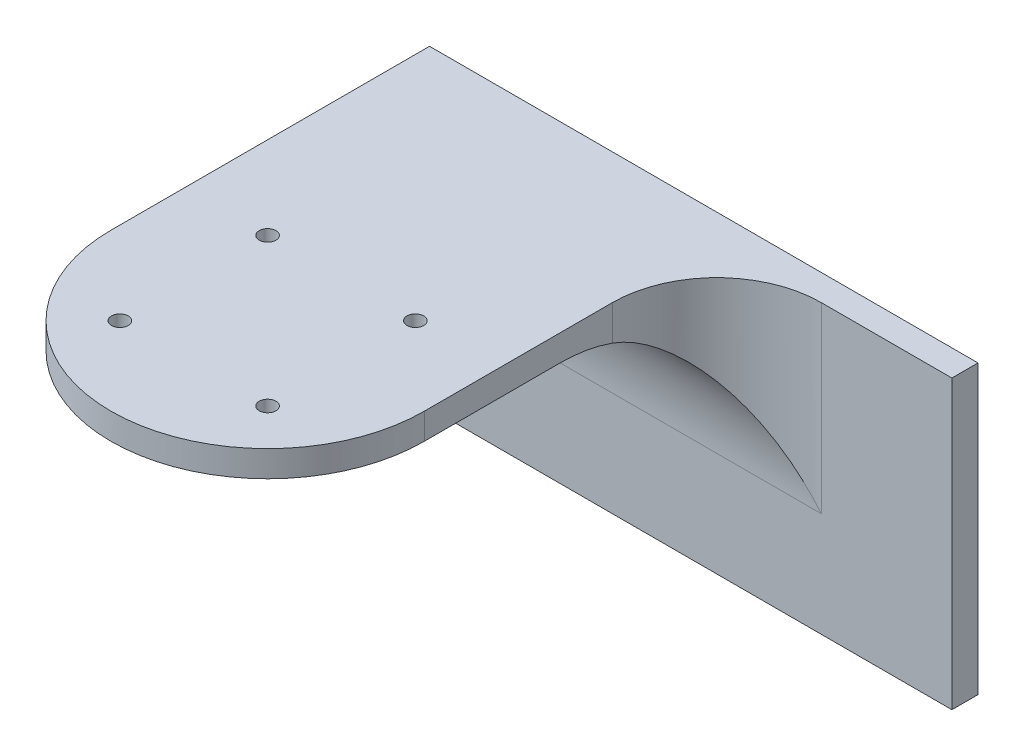
ISO-10303-21;
HEADER;
FILE_DESCRIPTION(('STEP AP214'),'2;1');
FILE_NAME('part.step','',(''),(''),'','','');
FILE_SCHEMA(('AUTOMOTIVE_DESIGN { 1 0 10303 214 1 1 1 1 }'));
ENDSEC;
DATA;
#1=APPLICATION_CONTEXT('core data for automotive mechanical design processes');
#2=APPLICATION_PROTOCOL_DEFINITION('international standard','automotive_design',2000,#1);
#3=PRODUCT_CONTEXT('',#1,'mechanical');
#4=PRODUCT('Part','Part','',(#3));
#5=PRODUCT_RELATED_PRODUCT_CATEGORY('part','',(#4));
#6=PRODUCT_DEFINITION_FORMATION('','',#4);
#7=PRODUCT_DEFINITION_CONTEXT('part definition',#1,'design');
#8=PRODUCT_DEFINITION('design','',#6,#7);
#9=PRODUCT_DEFINITION_SHAPE('','',#8);
#10=(LENGTH_UNIT() NAMED_UNIT(*) SI_UNIT(.MILLI.,.METRE.));
#11=(NAMED_UNIT(*) PLANE_ANGLE_UNIT() SI_UNIT($,.RADIAN.));
#12=(NAMED_UNIT(*) SI_UNIT($,.STERADIAN.) SOLID_ANGLE_UNIT());
#13=UNCERTAINTY_MEASURE_WITH_UNIT(LENGTH_MEASURE(1.E-05),#10,'distance_accuracy_value','');
#14=(GEOMETRIC_REPRESENTATION_CONTEXT(3) GLOBAL_UNCERTAINTY_ASSIGNED_CONTEXT((#13)) GLOBAL_UNIT_ASSIGNED_CONTEXT((#10,
#11,#12)) REPRESENTATION_CONTEXT('',''));
#15=CARTESIAN_POINT('',(0.,0.,0.));
#16=DIRECTION('',(0.,0.,1.));
#17=DIRECTION('',(1.,0.,0.));
#18=AXIS2_PLACEMENT_3D('',#15,#16,#17);
#19=CARTESIAN_POINT('',(30.,5.,0.));
#20=DIRECTION('',(1.,0.,0.));
#21=DIRECTION('',(0.,0.,-1.));
#22=AXIS2_PLACEMENT_3D('',#19,#20,#21);
#23=PLANE('',#22);
#24=CARTESIAN_POINT('',(30.,-30.,-26.));
#25=DIRECTION('',(1.,0.,0.));
#26=DIRECTION('',(0.,0.,-1.));
#27=AXIS2_PLACEMENT_3D('',#24,#25,#26);
#28=CIRCLE('',#27,30.);
#29=CARTESIAN_POINT('',(30.,0.,-26.));
#30=VERTEX_POINT('',#29);
#31=CARTESIAN_POINT('',(30.,-1.7157287525381,-36.));
#32=VERTEX_POINT('',#31);
#33=EDGE_CURVE('E205',#30,#32,#28,.F.);
#34=ORIENTED_EDGE('',*,*,#33,.T.);
#35=DIRECTION('',(0.,-1.,0.));
#36=VECTOR('',#35,1.);
#37=CARTESIAN_POINT('',(30.,5.,-36.));
#38=LINE('',#37,#36);
#39=CARTESIAN_POINT('',(30.,5.,-36.));
#40=VERTEX_POINT('',#39);
#41=EDGE_CURVE('E57',#32,#40,#38,.F.);
#42=ORIENTED_EDGE('',*,*,#41,.T.);
#43=DIRECTION('',(0.,0.,1.));
#44=VECTOR('',#43,1.);
#45=CARTESIAN_POINT('',(30.,5.,0.));
#46=LINE('',#45,#44);
#47=CARTESIAN_POINT('',(30.,5.,0.));
#48=VERTEX_POINT('',#47);
#49=EDGE_CURVE('E156',#40,#48,#46,.T.);
#50=ORIENTED_EDGE('',*,*,#49,.T.);
#51=DIRECTION('',(0.,-1.,0.));
#52=VECTOR('',#51,1.);
#53=CARTESIAN_POINT('',(30.,5.,0.));
#54=LINE('',#53,#52);
#55=CARTESIAN_POINT('',(30.,0.,0.));
#56=VERTEX_POINT('',#55);
#57=EDGE_CURVE('E162',#48,#56,#54,.T.);
#58=ORIENTED_EDGE('',*,*,#57,.T.);
#59=DIRECTION('',(0.,0.,1.));
#60=VECTOR('',#59,1.);
#61=CARTESIAN_POINT('',(30.,0.,0.));
#62=LINE('',#61,#60);
#63=EDGE_CURVE('E154',#30,#56,#62,.T.);
#64=ORIENTED_EDGE('',*,*,#63,.F.);
#65=EDGE_LOOP('',(#34,#42,#50,#58,#64));
#66=FACE_BOUND('',#65,.T.);
#67=ADVANCED_FACE('F41',(#66),#23,.T.);
#68=CARTESIAN_POINT('',(0.,0.,0.));
#69=DIRECTION('',(0.,1.,0.));
#70=DIRECTION('',(0.,0.,1.));
#71=AXIS2_PLACEMENT_3D('',#68,#69,#70);
#72=PLANE('',#71);
#73=CARTESIAN_POINT('',(14.142135623731,0.,14.1421356237309));
#74=DIRECTION('',(0.,1.,0.));
#75=DIRECTION('',(0.,0.,1.));
#76=AXIS2_PLACEMENT_3D('',#73,#74,#75);
#77=CIRCLE('',#76,1.6);
#78=CARTESIAN_POINT('',(14.142135623731,0.,15.7421356237309));
#79=VERTEX_POINT('',#78);
#80=EDGE_CURVE('E165',#79,#79,#77,.T.);
#81=ORIENTED_EDGE('',*,*,#80,.T.);
#82=EDGE_LOOP('',(#81));
#83=FACE_BOUND('',#82,.T.);
#84=CARTESIAN_POINT('',(-14.142135623731,0.,14.1421356237309));
#85=DIRECTION('',(0.,1.,0.));
#86=DIRECTION('',(0.,0.,1.));
#87=AXIS2_PLACEMENT_3D('',#84,#85,#86);
#88=CIRCLE('',#87,1.6);
#89=CARTESIAN_POINT('',(-14.142135623731,0.,15.7421356237309));
#90=VERTEX_POINT('',#89);
#91=EDGE_CURVE('E173',#90,#90,#88,.T.);
#92=ORIENTED_EDGE('',*,*,#91,.T.);
#93=EDGE_LOOP('',(#92));
#94=FACE_BOUND('',#93,.T.);
#95=CARTESIAN_POINT('',(-14.142135623731,0.,-14.1421356237309));
#96=DIRECTION('',(0.,1.,0.));
#97=DIRECTION('',(0.,0.,1.));
#98=AXIS2_PLACEMENT_3D('',#95,#96,#97);
#99=CIRCLE('',#98,1.6);
#100=CARTESIAN_POINT('',(-14.142135623731,0.,-12.5421356237309));
#101=VERTEX_POINT('',#100);
#102=EDGE_CURVE('E179',#101,#101,#99,.T.);
#103=ORIENTED_EDGE('',*,*,#102,.T.);
#104=EDGE_LOOP('',(#103));
#105=FACE_BOUND('',#104,.T.);
#106=CARTESIAN_POINT('',(14.142135623731,0.,-14.1421356237309));
#107=DIRECTION('',(0.,1.,0.));
#108=DIRECTION('',(0.,0.,1.));
#109=AXIS2_PLACEMENT_3D('',#106,#107,#108);
#110=CIRCLE('',#109,1.6);
#111=CARTESIAN_POINT('',(14.142135623731,0.,-12.5421356237309));
#112=VERTEX_POINT('',#111);
#113=EDGE_CURVE('E185',#112,#112,#110,.T.);
#114=ORIENTED_EDGE('',*,*,#113,.T.);
#115=EDGE_LOOP('',(#114));
#116=FACE_BOUND('',#115,.T.);
#117=DIRECTION('',(0.,0.,-1.));
#118=VECTOR('',#117,1.);
#119=CARTESIAN_POINT('',(-30.,0.,0.));
#120=LINE('',#119,#118);
#121=CARTESIAN_POINT('',(-30.,0.,0.));
#122=VERTEX_POINT('',#121);
#123=CARTESIAN_POINT('',(-30.,0.,-26.));
#124=VERTEX_POINT('',#123);
#125=EDGE_CURVE('E149',#122,#124,#120,.T.);
#126=ORIENTED_EDGE('',*,*,#125,.T.);
#127=DIRECTION('',(-1.,0.,0.));
#128=VECTOR('',#127,1.);
#129=CARTESIAN_POINT('',(30.,0.,-26.));
#130=LINE('',#129,#128);
#131=EDGE_CURVE('E201',#124,#30,#130,.F.);
#132=ORIENTED_EDGE('',*,*,#131,.T.);
#133=ORIENTED_EDGE('',*,*,#63,.T.);
#134=CARTESIAN_POINT('',(0.,0.,0.));
#135=DIRECTION('',(0.,1.,0.));
#136=DIRECTION('',(0.,0.,1.));
#137=AXIS2_PLACEMENT_3D('',#134,#135,#136);
#138=CIRCLE('',#137,30.);
#139=EDGE_CURVE('E191',#122,#56,#138,.T.);
#140=ORIENTED_EDGE('',*,*,#139,.F.);
#141=EDGE_LOOP('',(#126,#132,#133,#140));
#142=FACE_BOUND('',#141,.T.);
#143=ADVANCED_FACE('F222',(#83,#94,#105,#116,#142),#72,.F.);
#144=CARTESIAN_POINT('',(0.,5.,0.));
#145=DIRECTION('',(0.,-1.,0.));
#146=DIRECTION('',(0.,0.,-1.));
#147=AXIS2_PLACEMENT_3D('',#144,#145,#146);
#148=CYLINDRICAL_SURFACE('',#147,30.);
#149=ORIENTED_EDGE('',*,*,#57,.F.);
#150=CARTESIAN_POINT('',(0.,5.,0.));
#151=DIRECTION('',(0.,1.,0.));
#152=DIRECTION('',(0.,0.,1.));
#153=AXIS2_PLACEMENT_3D('',#150,#151,#152);
#154=CIRCLE('',#153,30.);
#155=CARTESIAN_POINT('',(-30.,5.,0.));
#156=VERTEX_POINT('',#155);
#157=EDGE_CURVE('E194',#156,#48,#154,.T.);
#158=ORIENTED_EDGE('',*,*,#157,.F.);
#159=DIRECTION('',(0.,-1.,0.));
#160=VECTOR('',#159,1.);
#161=CARTESIAN_POINT('',(-30.,5.,0.));
#162=LINE('',#161,#160);
#163=EDGE_CURVE('E158',#156,#122,#162,.T.);
#164=ORIENTED_EDGE('',*,*,#163,.T.);
#165=ORIENTED_EDGE('',*,*,#139,.T.);
#166=EDGE_LOOP('',(#149,#158,#164,#165));
#167=FACE_BOUND('',#166,.T.);
#168=ADVANCED_FACE('F218',(#167),#148,.T.);
#169=CARTESIAN_POINT('',(0.,5.,0.));
#170=DIRECTION('',(0.,1.,0.));
#171=DIRECTION('',(0.,0.,1.));
#172=AXIS2_PLACEMENT_3D('',#169,#170,#171);
#173=PLANE('',#172);
#174=CARTESIAN_POINT('',(-14.142135623731,5.,14.1421356237309));
#175=DIRECTION('',(0.,1.,0.));
#176=DIRECTION('',(0.,0.,1.));
#177=AXIS2_PLACEMENT_3D('',#174,#175,#176);
#178=CIRCLE('',#177,1.6);
#179=CARTESIAN_POINT('',(-14.142135623731,5.,15.7421356237309));
#180=VERTEX_POINT('',#179);
#181=EDGE_CURVE('E176',#180,#180,#178,.T.);
#182=ORIENTED_EDGE('',*,*,#181,.F.);
#183=EDGE_LOOP('',(#182));
#184=FACE_BOUND('',#183,.T.);
#185=CARTESIAN_POINT('',(14.142135623731,5.,-14.1421356237309));
#186=DIRECTION('',(0.,1.,0.));
#187=DIRECTION('',(0.,0.,1.));
#188=AXIS2_PLACEMENT_3D('',#185,#186,#187);
#189=CIRCLE('',#188,1.6);
#190=CARTESIAN_POINT('',(14.142135623731,5.,-12.5421356237309));
#191=VERTEX_POINT('',#190);
#192=EDGE_CURVE('E188',#191,#191,#189,.T.);
#193=ORIENTED_EDGE('',*,*,#192,.F.);
#194=EDGE_LOOP('',(#193));
#195=FACE_BOUND('',#194,.T.);
#196=ORIENTED_EDGE('',*,*,#157,.T.);
#197=ORIENTED_EDGE('',*,*,#49,.F.);
#198=CARTESIAN_POINT('',(50.,5.,-36.));
#199=DIRECTION('',(0.,1.,0.));
#200=DIRECTION('',(0.,0.,1.));
#201=AXIS2_PLACEMENT_3D('',#198,#199,#200);
#202=CIRCLE('',#201,20.);
#203=CARTESIAN_POINT('',(50.,5.,-56.));
#204=VERTEX_POINT('',#203);
#205=EDGE_CURVE('E11',#40,#204,#202,.F.);
#206=ORIENTED_EDGE('',*,*,#205,.T.);
#207=DIRECTION('',(-1.,0.,0.));
#208=VECTOR('',#207,1.);
#209=CARTESIAN_POINT('',(75.,5.,-56.));
#210=LINE('',#209,#208);
#211=CARTESIAN_POINT('',(75.,5.,-56.));
#212=VERTEX_POINT('',#211);
#213=EDGE_CURVE('E143',#212,#204,#210,.T.);
#214=ORIENTED_EDGE('',*,*,#213,.F.);
#215=DIRECTION('',(0.,0.,1.));
#216=VECTOR('',#215,1.);
#217=CARTESIAN_POINT('',(75.,5.,-56.));
#218=LINE('',#217,#216);
#219=CARTESIAN_POINT('',(75.,5.,-61.));
#220=VERTEX_POINT('',#219);
#221=EDGE_CURVE('E137',#220,#212,#218,.T.);
#222=ORIENTED_EDGE('',*,*,#221,.F.);
#223=DIRECTION('',(1.,0.,0.));
#224=VECTOR('',#223,1.);
#225=CARTESIAN_POINT('',(-30.,5.,-61.));
#226=LINE('',#225,#224);
#227=CARTESIAN_POINT('',(-30.,5.,-61.));
#228=VERTEX_POINT('',#227);
#229=EDGE_CURVE('E153',#228,#220,#226,.T.);
#230=ORIENTED_EDGE('',*,*,#229,.F.);
#231=DIRECTION('',(0.,0.,-1.));
#232=VECTOR('',#231,1.);
#233=CARTESIAN_POINT('',(-30.,5.,0.));
#234=LINE('',#233,#232);
#235=EDGE_CURVE('E150',#156,#228,#234,.T.);
#236=ORIENTED_EDGE('',*,*,#235,.F.);
#237=EDGE_LOOP('',(#196,#197,#206,#214,#222,#230,#236));
#238=FACE_BOUND('',#237,.T.);
#239=CARTESIAN_POINT('',(-14.142135623731,5.,-14.1421356237309));
#240=DIRECTION('',(0.,1.,0.));
#241=DIRECTION('',(0.,0.,1.));
#242=AXIS2_PLACEMENT_3D('',#239,#240,#241);
#243=CIRCLE('',#242,1.6);
#244=CARTESIAN_POINT('',(-14.142135623731,5.,-12.5421356237309));
#245=VERTEX_POINT('',#244);
#246=EDGE_CURVE('E182',#245,#245,#243,.T.);
#247=ORIENTED_EDGE('',*,*,#246,.F.);
#248=EDGE_LOOP('',(#247));
#249=FACE_BOUND('',#248,.T.);
#250=CARTESIAN_POINT('',(14.142135623731,5.,14.1421356237309));
#251=DIRECTION('',(0.,1.,0.));
#252=DIRECTION('',(0.,0.,1.));
#253=AXIS2_PLACEMENT_3D('',#250,#251,#252);
#254=CIRCLE('',#253,1.6);
#255=CARTESIAN_POINT('',(14.142135623731,5.,15.7421356237309));
#256=VERTEX_POINT('',#255);
#257=EDGE_CURVE('E170',#256,#256,#254,.T.);
#258=ORIENTED_EDGE('',*,*,#257,.F.);
#259=EDGE_LOOP('',(#258));
#260=FACE_BOUND('',#259,.T.);
#261=ADVANCED_FACE('F221',(#184,#195,#238,#249,#260),#173,.T.);
#262=CARTESIAN_POINT('',(14.142135623731,5.,-14.1421356237309));
#263=DIRECTION('',(0.,-1.,0.));
#264=DIRECTION('',(0.,0.,-1.));
#265=AXIS2_PLACEMENT_3D('',#262,#263,#264);
#266=CYLINDRICAL_SURFACE('',#265,1.6);
#267=ORIENTED_EDGE('',*,*,#192,.T.);
#268=EDGE_LOOP('',(#267));
#269=FACE_BOUND('',#268,.T.);
#270=ORIENTED_EDGE('',*,*,#113,.F.);
#271=EDGE_LOOP('',(#270));
#272=FACE_BOUND('',#271,.T.);
#273=ADVANCED_FACE('F229',(#269,#272),#266,.F.);
#274=CARTESIAN_POINT('',(-14.142135623731,5.,-14.1421356237309));
#275=DIRECTION('',(0.,-1.,0.));
#276=DIRECTION('',(0.,0.,-1.));
#277=AXIS2_PLACEMENT_3D('',#274,#275,#276);
#278=CYLINDRICAL_SURFACE('',#277,1.6);
#279=ORIENTED_EDGE('',*,*,#246,.T.);
#280=EDGE_LOOP('',(#279));
#281=FACE_BOUND('',#280,.T.);
#282=ORIENTED_EDGE('',*,*,#102,.F.);
#283=EDGE_LOOP('',(#282));
#284=FACE_BOUND('',#283,.T.);
#285=ADVANCED_FACE('F233',(#281,#284),#278,.F.);
#286=CARTESIAN_POINT('',(-14.142135623731,5.,14.1421356237309));
#287=DIRECTION('',(0.,-1.,0.));
#288=DIRECTION('',(0.,0.,-1.));
#289=AXIS2_PLACEMENT_3D('',#286,#287,#288);
#290=CYLINDRICAL_SURFACE('',#289,1.6);
#291=ORIENTED_EDGE('',*,*,#181,.T.);
#292=EDGE_LOOP('',(#291));
#293=FACE_BOUND('',#292,.T.);
#294=ORIENTED_EDGE('',*,*,#91,.F.);
#295=EDGE_LOOP('',(#294));
#296=FACE_BOUND('',#295,.T.);
#297=ADVANCED_FACE('F237',(#293,#296),#290,.F.);
#298=CARTESIAN_POINT('',(14.142135623731,5.,14.1421356237309));
#299=DIRECTION('',(0.,-1.,0.));
#300=DIRECTION('',(0.,0.,-1.));
#301=AXIS2_PLACEMENT_3D('',#298,#299,#300);
#302=CYLINDRICAL_SURFACE('',#301,1.6);
#303=ORIENTED_EDGE('',*,*,#257,.T.);
#304=EDGE_LOOP('',(#303));
#305=FACE_BOUND('',#304,.T.);
#306=ORIENTED_EDGE('',*,*,#80,.F.);
#307=EDGE_LOOP('',(#306));
#308=FACE_BOUND('',#307,.T.);
#309=ADVANCED_FACE('F241',(#305,#308),#302,.F.);
#310=CARTESIAN_POINT('',(-30.,5.,-61.));
#311=DIRECTION('',(0.,0.,-1.));
#312=DIRECTION('',(-1.,0.,0.));
#313=AXIS2_PLACEMENT_3D('',#310,#311,#312);
#314=PLANE('',#313);
#315=ORIENTED_EDGE('',*,*,#229,.T.);
#316=DIRECTION('',(0.,1.,0.));
#317=VECTOR('',#316,1.);
#318=CARTESIAN_POINT('',(75.,-50.,-61.));
#319=LINE('',#318,#317);
#320=CARTESIAN_POINT('',(75.,-50.,-61.));
#321=VERTEX_POINT('',#320);
#322=EDGE_CURVE('E133',#321,#220,#319,.T.);
#323=ORIENTED_EDGE('',*,*,#322,.F.);
#324=DIRECTION('',(1.,0.,0.));
#325=VECTOR('',#324,1.);
#326=CARTESIAN_POINT('',(-30.,-50.,-61.));
#327=LINE('',#326,#325);
#328=CARTESIAN_POINT('',(-30.,-50.,-61.));
#329=VERTEX_POINT('',#328);
#330=EDGE_CURVE('E124',#329,#321,#327,.T.);
#331=ORIENTED_EDGE('',*,*,#330,.F.);
#332=DIRECTION('',(0.,-1.,0.));
#333=VECTOR('',#332,1.);
#334=CARTESIAN_POINT('',(-30.,5.,-61.));
#335=LINE('',#334,#333);
#336=EDGE_CURVE('E166',#228,#329,#335,.T.);
#337=ORIENTED_EDGE('',*,*,#336,.F.);
#338=EDGE_LOOP('',(#315,#323,#331,#337));
#339=FACE_BOUND('',#338,.T.);
#340=ADVANCED_FACE('F245',(#339),#314,.T.);
#341=CARTESIAN_POINT('',(-30.,5.,0.));
#342=DIRECTION('',(-1.,0.,0.));
#343=DIRECTION('',(0.,0.,1.));
#344=AXIS2_PLACEMENT_3D('',#341,#342,#343);
#345=PLANE('',#344);
#346=ORIENTED_EDGE('',*,*,#125,.F.);
#347=ORIENTED_EDGE('',*,*,#163,.F.);
#348=ORIENTED_EDGE('',*,*,#235,.T.);
#349=ORIENTED_EDGE('',*,*,#336,.T.);
#350=DIRECTION('',(0.,0.,-1.));
#351=VECTOR('',#350,1.);
#352=CARTESIAN_POINT('',(-30.,-50.,-61.));
#353=LINE('',#352,#351);
#354=CARTESIAN_POINT('',(-30.,-50.,-56.));
#355=VERTEX_POINT('',#354);
#356=EDGE_CURVE('E145',#355,#329,#353,.T.);
#357=ORIENTED_EDGE('',*,*,#356,.F.);
#358=DIRECTION('',(0.,1.,0.));
#359=VECTOR('',#358,1.);
#360=CARTESIAN_POINT('',(-30.,-50.,-56.));
#361=LINE('',#360,#359);
#362=CARTESIAN_POINT('',(-30.,-30.,-56.));
#363=VERTEX_POINT('',#362);
#364=EDGE_CURVE('E120',#355,#363,#361,.T.);
#365=ORIENTED_EDGE('',*,*,#364,.T.);
#366=CARTESIAN_POINT('',(-30.,-30.,-26.));
#367=DIRECTION('',(-1.,0.,0.));
#368=DIRECTION('',(0.,0.,1.));
#369=AXIS2_PLACEMENT_3D('',#366,#367,#368);
#370=CIRCLE('',#369,30.);
#371=EDGE_CURVE('E203',#363,#124,#370,.F.);
#372=ORIENTED_EDGE('',*,*,#371,.T.);
#373=EDGE_LOOP('',(#346,#347,#348,#349,#357,#365,#372));
#374=FACE_BOUND('',#373,.T.);
#375=ADVANCED_FACE('F247',(#374),#345,.T.);
#376=CARTESIAN_POINT('',(-30.,-50.,-56.));
#377=DIRECTION('',(0.,0.,-1.));
#378=DIRECTION('',(-1.,0.,0.));
#379=AXIS2_PLACEMENT_3D('',#376,#377,#378);
#380=PLANE('',#379);
#381=ORIENTED_EDGE('',*,*,#213,.T.);
#382=DIRECTION('',(0.,-1.,0.));
#383=VECTOR('',#382,1.);
#384=CARTESIAN_POINT('',(50.,-50.,-56.));
#385=LINE('',#384,#383);
#386=CARTESIAN_POINT('',(50.,-30.,-56.));
#387=VERTEX_POINT('',#386);
#388=EDGE_CURVE('E207',#204,#387,#385,.T.);
#389=ORIENTED_EDGE('',*,*,#388,.T.);
#390=DIRECTION('',(-1.,0.,0.));
#391=VECTOR('',#390,1.);
#392=CARTESIAN_POINT('',(-30.,-30.,-56.));
#393=LINE('',#392,#391);
#394=EDGE_CURVE('E197',#387,#363,#393,.T.);
#395=ORIENTED_EDGE('',*,*,#394,.T.);
#396=ORIENTED_EDGE('',*,*,#364,.F.);
#397=DIRECTION('',(-1.,0.,0.));
#398=VECTOR('',#397,1.);
#399=CARTESIAN_POINT('',(-30.,-50.,-56.));
#400=LINE('',#399,#398);
#401=CARTESIAN_POINT('',(75.,-50.,-56.));
#402=VERTEX_POINT('',#401);
#403=EDGE_CURVE('E112',#402,#355,#400,.T.);
#404=ORIENTED_EDGE('',*,*,#403,.F.);
#405=DIRECTION('',(0.,-1.,0.));
#406=VECTOR('',#405,1.);
#407=CARTESIAN_POINT('',(75.,-50.,-56.));
#408=LINE('',#407,#406);
#409=EDGE_CURVE('E117',#212,#402,#408,.T.);
#410=ORIENTED_EDGE('',*,*,#409,.F.);
#411=EDGE_LOOP('',(#381,#389,#395,#396,#404,#410));
#412=FACE_BOUND('',#411,.T.);
#413=ADVANCED_FACE('F115',(#412),#380,.F.);
#414=CARTESIAN_POINT('',(0.,-50.,0.));
#415=DIRECTION('',(0.,1.,0.));
#416=DIRECTION('',(0.,0.,1.));
#417=AXIS2_PLACEMENT_3D('',#414,#415,#416);
#418=PLANE('',#417);
#419=ORIENTED_EDGE('',*,*,#356,.T.);
#420=ORIENTED_EDGE('',*,*,#330,.T.);
#421=DIRECTION('',(0.,0.,-1.));
#422=VECTOR('',#421,1.);
#423=CARTESIAN_POINT('',(75.,-50.,-56.));
#424=LINE('',#423,#422);
#425=EDGE_CURVE('E127',#402,#321,#424,.T.);
#426=ORIENTED_EDGE('',*,*,#425,.F.);
#427=ORIENTED_EDGE('',*,*,#403,.T.);
#428=EDGE_LOOP('',(#419,#420,#426,#427));
#429=FACE_BOUND('',#428,.T.);
#430=ADVANCED_FACE('F128',(#429),#418,.F.);
#431=CARTESIAN_POINT('',(-30.,-30.,-26.));
#432=DIRECTION('',(1.,0.,0.));
#433=DIRECTION('',(0.,0.,-1.));
#434=AXIS2_PLACEMENT_3D('',#431,#432,#433);
#435=CYLINDRICAL_SURFACE('',#434,30.);
#436=ORIENTED_EDGE('',*,*,#33,.F.);
#437=ORIENTED_EDGE('',*,*,#131,.F.);
#438=ORIENTED_EDGE('',*,*,#371,.F.);
#439=ORIENTED_EDGE('',*,*,#394,.F.);
#440=CARTESIAN_POINT('',(30.,-1.7157287525381,-36.));
#441=CARTESIAN_POINT('',(29.9999930948107,-1.81536678616711,-36.2818488233556));
#442=CARTESIAN_POINT('',(30.005957571046,-1.91922903873065,-36.5621815766427));
#443=CARTESIAN_POINT('',(30.0293943970698,-2.13508792447432,-37.1191594704881));
#444=CARTESIAN_POINT('',(30.0468648113315,-2.24708318670223,-37.3958052232888));
#445=CARTESIAN_POINT('',(30.0928444921743,-2.47875431466027,-37.9444381382878));
#446=CARTESIAN_POINT('',(30.1213372042878,-2.59841843866027,-38.2164316510301));
#447=CARTESIAN_POINT('',(30.1888861317535,-2.84523477039032,-38.7556532605113));
#448=CARTESIAN_POINT('',(30.2279427802565,-2.97238728499789,-39.0228811613678));
#449=CARTESIAN_POINT('',(30.3593412065543,-3.36191290187877,-39.8113494628475));
#450=CARTESIAN_POINT('',(30.4664092645607,-3.63476754328379,-40.3250720017956));
#451=CARTESIAN_POINT('',(30.7161774568456,-4.20573161184642,-41.3293791312611));
#452=CARTESIAN_POINT('',(30.8588943791015,-4.50385289389549,-41.8199526905455));
#453=CARTESIAN_POINT('',(31.2122510258561,-5.19301975560505,-42.8849723320195));
#454=CARTESIAN_POINT('',(31.4309575850857,-5.58976302982095,-43.4530669927568));
#455=CARTESIAN_POINT('',(31.9095361280971,-6.41212595962028,-44.549451523429));
#456=CARTESIAN_POINT('',(32.1694134841464,-6.8377493795476,-45.0777361853694));
#457=CARTESIAN_POINT('',(32.7254507572179,-7.71531520807471,-46.0959293198733));
#458=CARTESIAN_POINT('',(33.0217556308843,-8.16735874853232,-46.5856708606974));
#459=CARTESIAN_POINT('',(33.6444580214636,-9.09231657736616,-47.5244781152411));
#460=CARTESIAN_POINT('',(33.970857931182,-9.56523252371111,-47.9735405889996));
#461=CARTESIAN_POINT('',(34.7804059844645,-10.715092712862,-48.9976690974031));
#462=CARTESIAN_POINT('',(35.2753522631503,-11.4002035084126,-49.5542917760569));
#463=CARTESIAN_POINT('',(36.3041470893386,-12.7971491570552,-50.5930907505503));
#464=CARTESIAN_POINT('',(36.8380099278083,-13.5089937803672,-51.0752394932366));
#465=CARTESIAN_POINT('',(37.936922090962,-14.9542664832887,-51.9682130481513));
#466=CARTESIAN_POINT('',(38.5020020500256,-15.6877154222982,-52.3789660980871));
#467=CARTESIAN_POINT('',(39.6561092072412,-17.1707838179578,-53.1312099108918));
#468=CARTESIAN_POINT('',(40.2451348260197,-17.9204022066004,-53.4727052328944));
#469=CARTESIAN_POINT('',(41.5710293469745,-19.5955259903954,-54.1555040332844));
#470=CARTESIAN_POINT('',(42.3123440729966,-20.5240394222875,-54.4808239227823));
#471=CARTESIAN_POINT('',(43.814281365796,-22.394148949981,-55.036231909521));
#472=CARTESIAN_POINT('',(44.5749104034226,-23.3357493811746,-55.2662876315677));
#473=CARTESIAN_POINT('',(46.1065905856128,-25.2249646293601,-55.6331413984199));
#474=CARTESIAN_POINT('',(46.8776155819644,-26.1725619976514,-55.7701403963197));
#475=CARTESIAN_POINT('',(48.4252180281711,-28.0712801448378,-55.9531100801602));
#476=CARTESIAN_POINT('',(49.2017916920916,-29.02239834099,-55.9991378069803));
#477=CARTESIAN_POINT('',(49.9853940907558,-29.9821114874079,-55.9999959981394));
#478=CARTESIAN_POINT('',(49.9926970588831,-29.9910557601645,-55.9999999980708));
#479=CARTESIAN_POINT('',(50.,-30.,-56.));
#480=B_SPLINE_CURVE_WITH_KNOTS('',3,(#440,#441,#442,#443,#444,#445,#446,#447,#448,#449,#450,
#451,#452,#453,#454,#455,#456,#457,#458,#459,#460,#461,#462,#463,#464,#465,#466,#467,#468,#469,
#470,#471,#472,#473,#474,#475,#476,#477,#478,#479),.UNSPECIFIED.,.F.,.F.,(4,2,2,2,2,2,2,2,2,2,2,
2,2,2,2,2,2,2,2,4),(0.,0.896701126897185,1.79325144940985,2.68846043196296,3.58370612613284,
5.35564310472459,7.12841611293142,9.30503096331775,11.4819300686716,13.6677905865669,
15.8538250486619,18.885372145111,21.9180381516574,24.9537349872511,27.9892319225114,
31.6805881993229,35.3731979431164,39.0578080419615,42.7401070797557,42.7747480979856),.UNSPECIFIED.);
#481=EDGE_CURVE('E50',#387,#32,#480,.F.);
#482=ORIENTED_EDGE('',*,*,#481,.T.);
#483=EDGE_LOOP('',(#436,#437,#438,#439,#482));
#484=FACE_BOUND('',#483,.T.);
#485=ADVANCED_FACE('F214',(#484),#435,.F.);
#486=CARTESIAN_POINT('',(75.,0.,0.));
#487=DIRECTION('',(-1.,0.,0.));
#488=DIRECTION('',(0.,0.,1.));
#489=AXIS2_PLACEMENT_3D('',#486,#487,#488);
#490=PLANE('',#489);
#491=ORIENTED_EDGE('',*,*,#409,.T.);
#492=ORIENTED_EDGE('',*,*,#425,.T.);
#493=ORIENTED_EDGE('',*,*,#322,.T.);
#494=ORIENTED_EDGE('',*,*,#221,.T.);
#495=EDGE_LOOP('',(#491,#492,#493,#494));
#496=FACE_BOUND('',#495,.T.);
#497=ADVANCED_FACE('F135',(#496),#490,.F.);
#498=CARTESIAN_POINT('',(50.,-50.,-36.));
#499=DIRECTION('',(0.,-1.,0.));
#500=DIRECTION('',(0.,0.,-1.));
#501=AXIS2_PLACEMENT_3D('',#498,#499,#500);
#502=CYLINDRICAL_SURFACE('',#501,20.);
#503=ORIENTED_EDGE('',*,*,#205,.F.);
#504=ORIENTED_EDGE('',*,*,#41,.F.);
#505=ORIENTED_EDGE('',*,*,#481,.F.);
#506=ORIENTED_EDGE('',*,*,#388,.F.);
#507=EDGE_LOOP('',(#503,#504,#505,#506));
#508=FACE_BOUND('',#507,.T.);
#509=ADVANCED_FACE('F43',(#508),#502,.F.);
#510=CLOSED_SHELL('',(#67,#143,#168,#261,#273,#285,#297,#309,#340,#375,#413,#430,#485,#497,#509));
#511=MANIFOLD_SOLID_BREP('B2',#510);
#512=ADVANCED_BREP_SHAPE_REPRESENTATION('',(#18,#511),#14);
#513=SHAPE_DEFINITION_REPRESENTATION(#9,#512);
ENDSEC;
END-ISO-10303-21;
